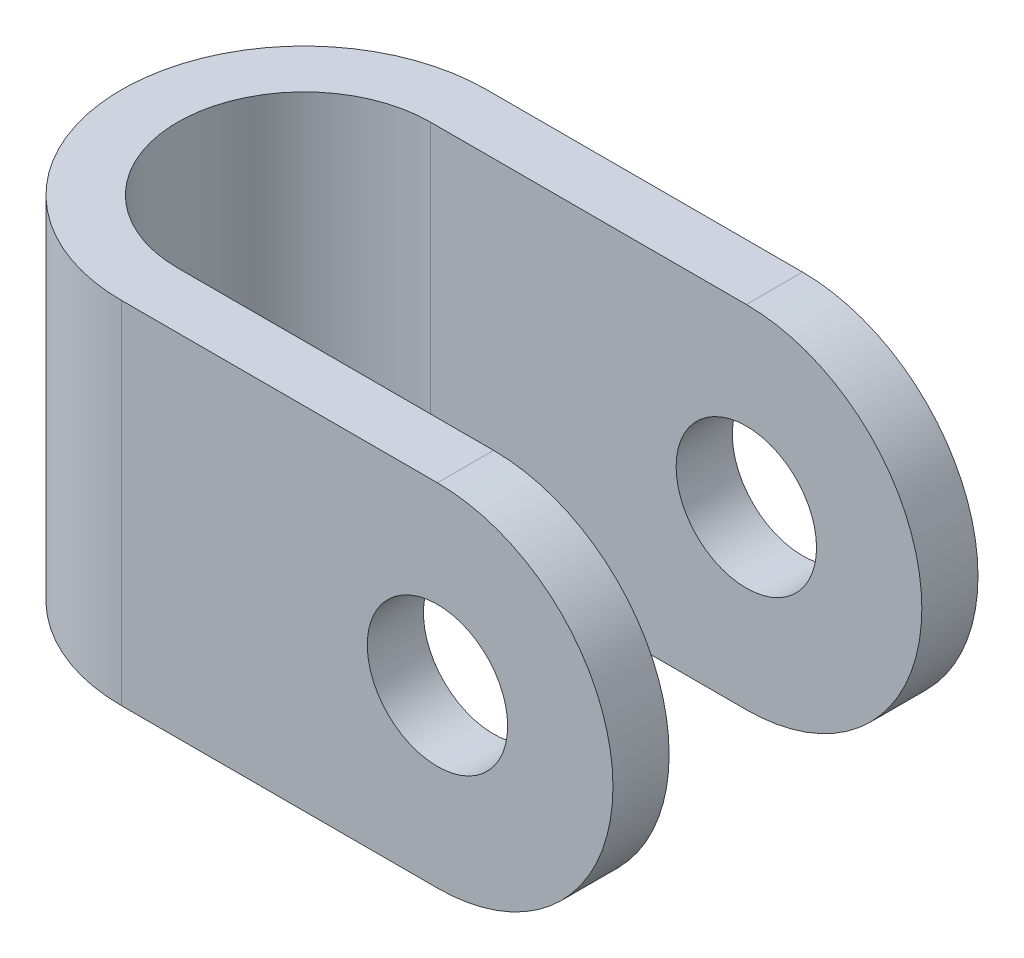
ISO-10303-21;
HEADER;
FILE_DESCRIPTION(('STEP AP214'),'2;1');
FILE_NAME('part.step','',(''),(''),'','','');
FILE_SCHEMA(('AUTOMOTIVE_DESIGN { 1 0 10303 214 1 1 1 1 }'));
ENDSEC;
DATA;
#1=APPLICATION_CONTEXT('core data for automotive mechanical design processes');
#2=APPLICATION_PROTOCOL_DEFINITION('international standard','automotive_design',2000,#1);
#3=PRODUCT_CONTEXT('',#1,'mechanical');
#4=PRODUCT('Part','Part','',(#3));
#5=PRODUCT_RELATED_PRODUCT_CATEGORY('part','',(#4));
#6=PRODUCT_DEFINITION_FORMATION('','',#4);
#7=PRODUCT_DEFINITION_CONTEXT('part definition',#1,'design');
#8=PRODUCT_DEFINITION('design','',#6,#7);
#9=PRODUCT_DEFINITION_SHAPE('','',#8);
#10=(LENGTH_UNIT() NAMED_UNIT(*) SI_UNIT(.MILLI.,.METRE.));
#11=(NAMED_UNIT(*) PLANE_ANGLE_UNIT() SI_UNIT($,.RADIAN.));
#12=(NAMED_UNIT(*) SI_UNIT($,.STERADIAN.) SOLID_ANGLE_UNIT());
#13=UNCERTAINTY_MEASURE_WITH_UNIT(LENGTH_MEASURE(1.E-05),#10,'distance_accuracy_value','');
#14=(GEOMETRIC_REPRESENTATION_CONTEXT(3) GLOBAL_UNCERTAINTY_ASSIGNED_CONTEXT((#13)) GLOBAL_UNIT_ASSIGNED_CONTEXT((#10,
#11,#12)) REPRESENTATION_CONTEXT('',''));
#15=CARTESIAN_POINT('',(0.,0.,0.));
#16=DIRECTION('',(0.,0.,1.));
#17=DIRECTION('',(1.,0.,0.));
#18=AXIS2_PLACEMENT_3D('',#15,#16,#17);
#19=CARTESIAN_POINT('',(0.,-12.5,0.));
#20=DIRECTION('',(0.,1.,0.));
#21=DIRECTION('',(0.,0.,1.));
#22=AXIS2_PLACEMENT_3D('',#19,#20,#21);
#23=PLANE('',#22);
#24=DIRECTION('',(0.,0.,1.));
#25=VECTOR('',#24,1.);
#26=CARTESIAN_POINT('',(22.5,-12.5,-13.));
#27=LINE('',#26,#25);
#28=CARTESIAN_POINT('',(22.5,-12.5,13.));
#29=VERTEX_POINT('',#28);
#30=CARTESIAN_POINT('',(22.5,-12.5,9.));
#31=VERTEX_POINT('',#30);
#32=EDGE_CURVE('E12',#29,#31,#27,.F.);
#33=ORIENTED_EDGE('',*,*,#32,.F.);
#34=DIRECTION('',(1.,0.,0.));
#35=VECTOR('',#34,1.);
#36=CARTESIAN_POINT('',(0.,-12.5,13.));
#37=LINE('',#36,#35);
#38=CARTESIAN_POINT('',(0.,-12.5,13.));
#39=VERTEX_POINT('',#38);
#40=EDGE_CURVE('E132',#39,#29,#37,.T.);
#41=ORIENTED_EDGE('',*,*,#40,.F.);
#42=CARTESIAN_POINT('',(0.,-12.5,0.));
#43=DIRECTION('',(0.,1.,0.));
#44=DIRECTION('',(0.,0.,1.));
#45=AXIS2_PLACEMENT_3D('',#42,#43,#44);
#46=CIRCLE('',#45,13.);
#47=CARTESIAN_POINT('',(0.,-12.5,-13.));
#48=VERTEX_POINT('',#47);
#49=EDGE_CURVE('E139',#48,#39,#46,.T.);
#50=ORIENTED_EDGE('',*,*,#49,.F.);
#51=DIRECTION('',(-1.,0.,0.));
#52=VECTOR('',#51,1.);
#53=CARTESIAN_POINT('',(0.,-12.5,-13.));
#54=LINE('',#53,#52);
#55=CARTESIAN_POINT('',(22.5,-12.5,-13.));
#56=VERTEX_POINT('',#55);
#57=EDGE_CURVE('E143',#56,#48,#54,.T.);
#58=ORIENTED_EDGE('',*,*,#57,.F.);
#59=DIRECTION('',(0.,0.,1.));
#60=VECTOR('',#59,1.);
#61=CARTESIAN_POINT('',(22.5,-12.5,-13.));
#62=LINE('',#61,#60);
#63=CARTESIAN_POINT('',(22.5,-12.5,-8.99999999999999));
#64=VERTEX_POINT('',#63);
#65=EDGE_CURVE('E127',#56,#64,#62,.T.);
#66=ORIENTED_EDGE('',*,*,#65,.T.);
#67=DIRECTION('',(1.,0.,0.));
#68=VECTOR('',#67,1.);
#69=CARTESIAN_POINT('',(0.,-12.5,-8.99999999999999));
#70=LINE('',#69,#68);
#71=CARTESIAN_POINT('',(0.,-12.5,-8.99999999999999));
#72=VERTEX_POINT('',#71);
#73=EDGE_CURVE('E177',#72,#64,#70,.T.);
#74=ORIENTED_EDGE('',*,*,#73,.F.);
#75=CARTESIAN_POINT('',(0.,-12.5,0.));
#76=DIRECTION('',(0.,-1.,0.));
#77=DIRECTION('',(0.,0.,-1.));
#78=AXIS2_PLACEMENT_3D('',#75,#76,#77);
#79=CIRCLE('',#78,8.99999999999999);
#80=CARTESIAN_POINT('',(0.,-12.5,9.));
#81=VERTEX_POINT('',#80);
#82=EDGE_CURVE('E175',#81,#72,#79,.T.);
#83=ORIENTED_EDGE('',*,*,#82,.F.);
#84=DIRECTION('',(-1.,0.,0.));
#85=VECTOR('',#84,1.);
#86=CARTESIAN_POINT('',(0.,-12.5,9.));
#87=LINE('',#86,#85);
#88=EDGE_CURVE('E134',#31,#81,#87,.T.);
#89=ORIENTED_EDGE('',*,*,#88,.F.);
#90=EDGE_LOOP('',(#33,#41,#50,#58,#66,#74,#83,#89));
#91=FACE_BOUND('',#90,.T.);
#92=ADVANCED_FACE('F57',(#91),#23,.F.);
#93=CARTESIAN_POINT('',(0.,12.5,0.));
#94=DIRECTION('',(0.,1.,0.));
#95=DIRECTION('',(0.,0.,1.));
#96=AXIS2_PLACEMENT_3D('',#93,#94,#95);
#97=PLANE('',#96);
#98=DIRECTION('',(1.,0.,0.));
#99=VECTOR('',#98,1.);
#100=CARTESIAN_POINT('',(0.,12.5,13.));
#101=LINE('',#100,#99);
#102=CARTESIAN_POINT('',(0.,12.5,13.));
#103=VERTEX_POINT('',#102);
#104=CARTESIAN_POINT('',(22.5,12.5,13.));
#105=VERTEX_POINT('',#104);
#106=EDGE_CURVE('E166',#103,#105,#101,.T.);
#107=ORIENTED_EDGE('',*,*,#106,.T.);
#108=DIRECTION('',(0.,0.,1.));
#109=VECTOR('',#108,1.);
#110=CARTESIAN_POINT('',(22.5,12.5,-13.));
#111=LINE('',#110,#109);
#112=CARTESIAN_POINT('',(22.5,12.5,9.));
#113=VERTEX_POINT('',#112);
#114=EDGE_CURVE('E65',#105,#113,#111,.F.);
#115=ORIENTED_EDGE('',*,*,#114,.T.);
#116=DIRECTION('',(-1.,0.,0.));
#117=VECTOR('',#116,1.);
#118=CARTESIAN_POINT('',(0.,12.5,9.));
#119=LINE('',#118,#117);
#120=CARTESIAN_POINT('',(0.,12.5,9.));
#121=VERTEX_POINT('',#120);
#122=EDGE_CURVE('E150',#113,#121,#119,.T.);
#123=ORIENTED_EDGE('',*,*,#122,.T.);
#124=CARTESIAN_POINT('',(0.,12.5,0.));
#125=DIRECTION('',(0.,-1.,0.));
#126=DIRECTION('',(0.,0.,1.));
#127=AXIS2_PLACEMENT_3D('',#124,#125,#126);
#128=CIRCLE('',#127,8.99999999999999);
#129=CARTESIAN_POINT('',(0.,12.5,-8.99999999999999));
#130=VERTEX_POINT('',#129);
#131=EDGE_CURVE('E141',#121,#130,#128,.T.);
#132=ORIENTED_EDGE('',*,*,#131,.T.);
#133=DIRECTION('',(1.,0.,0.));
#134=VECTOR('',#133,1.);
#135=CARTESIAN_POINT('',(0.,12.5,-8.99999999999999));
#136=LINE('',#135,#134);
#137=CARTESIAN_POINT('',(22.5,12.5,-8.99999999999999));
#138=VERTEX_POINT('',#137);
#139=EDGE_CURVE('E189',#130,#138,#136,.T.);
#140=ORIENTED_EDGE('',*,*,#139,.T.);
#141=DIRECTION('',(0.,0.,1.));
#142=VECTOR('',#141,1.);
#143=CARTESIAN_POINT('',(22.5,12.5,-13.));
#144=LINE('',#143,#142);
#145=CARTESIAN_POINT('',(22.5,12.5,-13.));
#146=VERTEX_POINT('',#145);
#147=EDGE_CURVE('E206',#146,#138,#144,.T.);
#148=ORIENTED_EDGE('',*,*,#147,.F.);
#149=DIRECTION('',(-1.,0.,0.));
#150=VECTOR('',#149,1.);
#151=CARTESIAN_POINT('',(0.,12.5,-13.));
#152=LINE('',#151,#150);
#153=CARTESIAN_POINT('',(0.,12.5,-13.));
#154=VERTEX_POINT('',#153);
#155=EDGE_CURVE('E188',#146,#154,#152,.T.);
#156=ORIENTED_EDGE('',*,*,#155,.T.);
#157=CARTESIAN_POINT('',(0.,12.5,0.));
#158=DIRECTION('',(0.,1.,0.));
#159=DIRECTION('',(0.,0.,-1.));
#160=AXIS2_PLACEMENT_3D('',#157,#158,#159);
#161=CIRCLE('',#160,13.);
#162=EDGE_CURVE('E171',#154,#103,#161,.T.);
#163=ORIENTED_EDGE('',*,*,#162,.T.);
#164=EDGE_LOOP('',(#107,#115,#123,#132,#140,#148,#156,#163));
#165=FACE_BOUND('',#164,.T.);
#166=ADVANCED_FACE('F164',(#165),#97,.T.);
#167=CARTESIAN_POINT('',(0.,12.5,0.));
#168=DIRECTION('',(0.,-1.,0.));
#169=DIRECTION('',(0.,0.,-1.));
#170=AXIS2_PLACEMENT_3D('',#167,#168,#169);
#171=CYLINDRICAL_SURFACE('',#170,8.99999999999999);
#172=ORIENTED_EDGE('',*,*,#82,.T.);
#173=DIRECTION('',(0.,-1.,0.));
#174=VECTOR('',#173,1.);
#175=CARTESIAN_POINT('',(0.,12.5,-8.99999999999999));
#176=LINE('',#175,#174);
#177=EDGE_CURVE('E155',#130,#72,#176,.T.);
#178=ORIENTED_EDGE('',*,*,#177,.F.);
#179=ORIENTED_EDGE('',*,*,#131,.F.);
#180=DIRECTION('',(0.,-1.,0.));
#181=VECTOR('',#180,1.);
#182=CARTESIAN_POINT('',(0.,12.5,9.));
#183=LINE('',#182,#181);
#184=EDGE_CURVE('E147',#121,#81,#183,.T.);
#185=ORIENTED_EDGE('',*,*,#184,.T.);
#186=EDGE_LOOP('',(#172,#178,#179,#185));
#187=FACE_BOUND('',#186,.T.);
#188=ADVANCED_FACE('F59',(#187),#171,.F.);
#189=CARTESIAN_POINT('',(0.,12.5,-8.99999999999999));
#190=DIRECTION('',(0.,0.,-1.));
#191=DIRECTION('',(-1.,0.,0.));
#192=AXIS2_PLACEMENT_3D('',#189,#190,#191);
#193=PLANE('',#192);
#194=CARTESIAN_POINT('',(22.5,0.,-8.99999999999999));
#195=DIRECTION('',(0.,0.,-1.));
#196=DIRECTION('',(-1.,0.,0.));
#197=AXIS2_PLACEMENT_3D('',#194,#195,#196);
#198=CIRCLE('',#197,5.);
#199=CARTESIAN_POINT('',(17.5,0.,-8.99999999999999));
#200=VERTEX_POINT('',#199);
#201=EDGE_CURVE('E160',#200,#200,#198,.T.);
#202=ORIENTED_EDGE('',*,*,#201,.T.);
#203=EDGE_LOOP('',(#202));
#204=FACE_BOUND('',#203,.T.);
#205=ORIENTED_EDGE('',*,*,#73,.T.);
#206=CARTESIAN_POINT('',(22.5,0.,-8.99999999999999));
#207=DIRECTION('',(0.,0.,-1.));
#208=DIRECTION('',(-1.,0.,0.));
#209=AXIS2_PLACEMENT_3D('',#206,#207,#208);
#210=CIRCLE('',#209,12.5);
#211=EDGE_CURVE('E200',#64,#138,#210,.F.);
#212=ORIENTED_EDGE('',*,*,#211,.T.);
#213=ORIENTED_EDGE('',*,*,#139,.F.);
#214=ORIENTED_EDGE('',*,*,#177,.T.);
#215=EDGE_LOOP('',(#205,#212,#213,#214));
#216=FACE_BOUND('',#215,.T.);
#217=ADVANCED_FACE('F211',(#204,#216),#193,.F.);
#218=CARTESIAN_POINT('',(0.,12.5,-13.));
#219=DIRECTION('',(0.,0.,1.));
#220=DIRECTION('',(1.,0.,0.));
#221=AXIS2_PLACEMENT_3D('',#218,#219,#220);
#222=PLANE('',#221);
#223=CARTESIAN_POINT('',(22.5,0.,-13.));
#224=DIRECTION('',(0.,0.,1.));
#225=DIRECTION('',(1.,0.,0.));
#226=AXIS2_PLACEMENT_3D('',#223,#224,#225);
#227=CIRCLE('',#226,5.);
#228=CARTESIAN_POINT('',(27.5,0.,-13.));
#229=VERTEX_POINT('',#228);
#230=EDGE_CURVE('E161',#229,#229,#227,.T.);
#231=ORIENTED_EDGE('',*,*,#230,.T.);
#232=EDGE_LOOP('',(#231));
#233=FACE_BOUND('',#232,.T.);
#234=CARTESIAN_POINT('',(22.5,0.,-13.));
#235=DIRECTION('',(0.,0.,1.));
#236=DIRECTION('',(1.,0.,0.));
#237=AXIS2_PLACEMENT_3D('',#234,#235,#236);
#238=CIRCLE('',#237,12.5);
#239=EDGE_CURVE('E79',#146,#56,#238,.F.);
#240=ORIENTED_EDGE('',*,*,#239,.T.);
#241=ORIENTED_EDGE('',*,*,#57,.T.);
#242=DIRECTION('',(0.,-1.,0.));
#243=VECTOR('',#242,1.);
#244=CARTESIAN_POINT('',(0.,12.5,-13.));
#245=LINE('',#244,#243);
#246=EDGE_CURVE('E152',#154,#48,#245,.T.);
#247=ORIENTED_EDGE('',*,*,#246,.F.);
#248=ORIENTED_EDGE('',*,*,#155,.F.);
#249=EDGE_LOOP('',(#240,#241,#247,#248));
#250=FACE_BOUND('',#249,.T.);
#251=ADVANCED_FACE('F182',(#233,#250),#222,.F.);
#252=CARTESIAN_POINT('',(0.,12.5,0.));
#253=DIRECTION('',(0.,-1.,0.));
#254=DIRECTION('',(0.,0.,-1.));
#255=AXIS2_PLACEMENT_3D('',#252,#253,#254);
#256=CYLINDRICAL_SURFACE('',#255,13.);
#257=ORIENTED_EDGE('',*,*,#49,.T.);
#258=DIRECTION('',(0.,-1.,0.));
#259=VECTOR('',#258,1.);
#260=CARTESIAN_POINT('',(0.,12.5,13.));
#261=LINE('',#260,#259);
#262=EDGE_CURVE('E138',#103,#39,#261,.T.);
#263=ORIENTED_EDGE('',*,*,#262,.F.);
#264=ORIENTED_EDGE('',*,*,#162,.F.);
#265=ORIENTED_EDGE('',*,*,#246,.T.);
#266=EDGE_LOOP('',(#257,#263,#264,#265));
#267=FACE_BOUND('',#266,.T.);
#268=ADVANCED_FACE('F187',(#267),#256,.T.);
#269=CARTESIAN_POINT('',(0.,12.5,13.));
#270=DIRECTION('',(0.,0.,-1.));
#271=DIRECTION('',(-1.,0.,0.));
#272=AXIS2_PLACEMENT_3D('',#269,#270,#271);
#273=PLANE('',#272);
#274=CARTESIAN_POINT('',(22.5,0.,13.));
#275=DIRECTION('',(0.,0.,1.));
#276=DIRECTION('',(1.,0.,0.));
#277=AXIS2_PLACEMENT_3D('',#274,#275,#276);
#278=CIRCLE('',#277,5.);
#279=CARTESIAN_POINT('',(27.5,0.,13.));
#280=VERTEX_POINT('',#279);
#281=EDGE_CURVE('E197',#280,#280,#278,.T.);
#282=ORIENTED_EDGE('',*,*,#281,.F.);
#283=EDGE_LOOP('',(#282));
#284=FACE_BOUND('',#283,.T.);
#285=ORIENTED_EDGE('',*,*,#40,.T.);
#286=CARTESIAN_POINT('',(22.5,0.,13.));
#287=DIRECTION('',(0.,0.,1.));
#288=DIRECTION('',(1.,0.,0.));
#289=AXIS2_PLACEMENT_3D('',#286,#287,#288);
#290=CIRCLE('',#289,12.5);
#291=EDGE_CURVE('E119',#105,#29,#290,.F.);
#292=ORIENTED_EDGE('',*,*,#291,.F.);
#293=ORIENTED_EDGE('',*,*,#106,.F.);
#294=ORIENTED_EDGE('',*,*,#262,.T.);
#295=EDGE_LOOP('',(#285,#292,#293,#294));
#296=FACE_BOUND('',#295,.T.);
#297=ADVANCED_FACE('F136',(#284,#296),#273,.F.);
#298=CARTESIAN_POINT('',(0.,12.5,9.));
#299=DIRECTION('',(0.,0.,1.));
#300=DIRECTION('',(1.,0.,0.));
#301=AXIS2_PLACEMENT_3D('',#298,#299,#300);
#302=PLANE('',#301);
#303=CARTESIAN_POINT('',(22.5,0.,9.));
#304=DIRECTION('',(0.,0.,1.));
#305=DIRECTION('',(1.,0.,0.));
#306=AXIS2_PLACEMENT_3D('',#303,#304,#305);
#307=CIRCLE('',#306,5.);
#308=CARTESIAN_POINT('',(27.5,0.,9.));
#309=VERTEX_POINT('',#308);
#310=EDGE_CURVE('E158',#309,#309,#307,.T.);
#311=ORIENTED_EDGE('',*,*,#310,.T.);
#312=EDGE_LOOP('',(#311));
#313=FACE_BOUND('',#312,.T.);
#314=CARTESIAN_POINT('',(22.5,0.,9.));
#315=DIRECTION('',(0.,0.,1.));
#316=DIRECTION('',(1.,0.,0.));
#317=AXIS2_PLACEMENT_3D('',#314,#315,#316);
#318=CIRCLE('',#317,12.5);
#319=EDGE_CURVE('E71',#113,#31,#318,.F.);
#320=ORIENTED_EDGE('',*,*,#319,.T.);
#321=ORIENTED_EDGE('',*,*,#88,.T.);
#322=ORIENTED_EDGE('',*,*,#184,.F.);
#323=ORIENTED_EDGE('',*,*,#122,.F.);
#324=EDGE_LOOP('',(#320,#321,#322,#323));
#325=FACE_BOUND('',#324,.T.);
#326=ADVANCED_FACE('F168',(#313,#325),#302,.F.);
#327=CARTESIAN_POINT('',(22.5,0.,-13.));
#328=DIRECTION('',(0.,0.,1.));
#329=DIRECTION('',(1.,0.,0.));
#330=AXIS2_PLACEMENT_3D('',#327,#328,#329);
#331=CYLINDRICAL_SURFACE('',#330,5.);
#332=ORIENTED_EDGE('',*,*,#281,.T.);
#333=EDGE_LOOP('',(#332));
#334=FACE_BOUND('',#333,.T.);
#335=ORIENTED_EDGE('',*,*,#310,.F.);
#336=EDGE_LOOP('',(#335));
#337=FACE_BOUND('',#336,.T.);
#338=ADVANCED_FACE('F223',(#334,#337),#331,.F.);
#339=ORIENTED_EDGE('',*,*,#230,.F.);
#340=EDGE_LOOP('',(#339));
#341=FACE_BOUND('',#340,.T.);
#342=ORIENTED_EDGE('',*,*,#201,.F.);
#343=EDGE_LOOP('',(#342));
#344=FACE_BOUND('',#343,.T.);
#345=ADVANCED_FACE('F217',(#341,#344),#331,.F.);
#346=CARTESIAN_POINT('',(22.5,0.,-13.));
#347=DIRECTION('',(0.,0.,1.));
#348=DIRECTION('',(1.,0.,0.));
#349=AXIS2_PLACEMENT_3D('',#346,#347,#348);
#350=CYLINDRICAL_SURFACE('',#349,12.5);
#351=ORIENTED_EDGE('',*,*,#211,.F.);
#352=ORIENTED_EDGE('',*,*,#65,.F.);
#353=ORIENTED_EDGE('',*,*,#239,.F.);
#354=ORIENTED_EDGE('',*,*,#147,.T.);
#355=EDGE_LOOP('',(#351,#352,#353,#354));
#356=FACE_BOUND('',#355,.T.);
#357=ADVANCED_FACE('F215',(#356),#350,.T.);
#358=ORIENTED_EDGE('',*,*,#114,.F.);
#359=ORIENTED_EDGE('',*,*,#291,.T.);
#360=ORIENTED_EDGE('',*,*,#32,.T.);
#361=ORIENTED_EDGE('',*,*,#319,.F.);
#362=EDGE_LOOP('',(#358,#359,#360,#361));
#363=FACE_BOUND('',#362,.T.);
#364=ADVANCED_FACE('F121',(#363),#350,.T.);
#365=CLOSED_SHELL('',(#92,#166,#188,#217,#251,#268,#297,#326,#338,#345,#357,#364));
#366=MANIFOLD_SOLID_BREP('B2',#365);
#367=ADVANCED_BREP_SHAPE_REPRESENTATION('',(#18,#366),#14);
#368=SHAPE_DEFINITION_REPRESENTATION(#9,#367);
ENDSEC;
END-ISO-10303-21;
